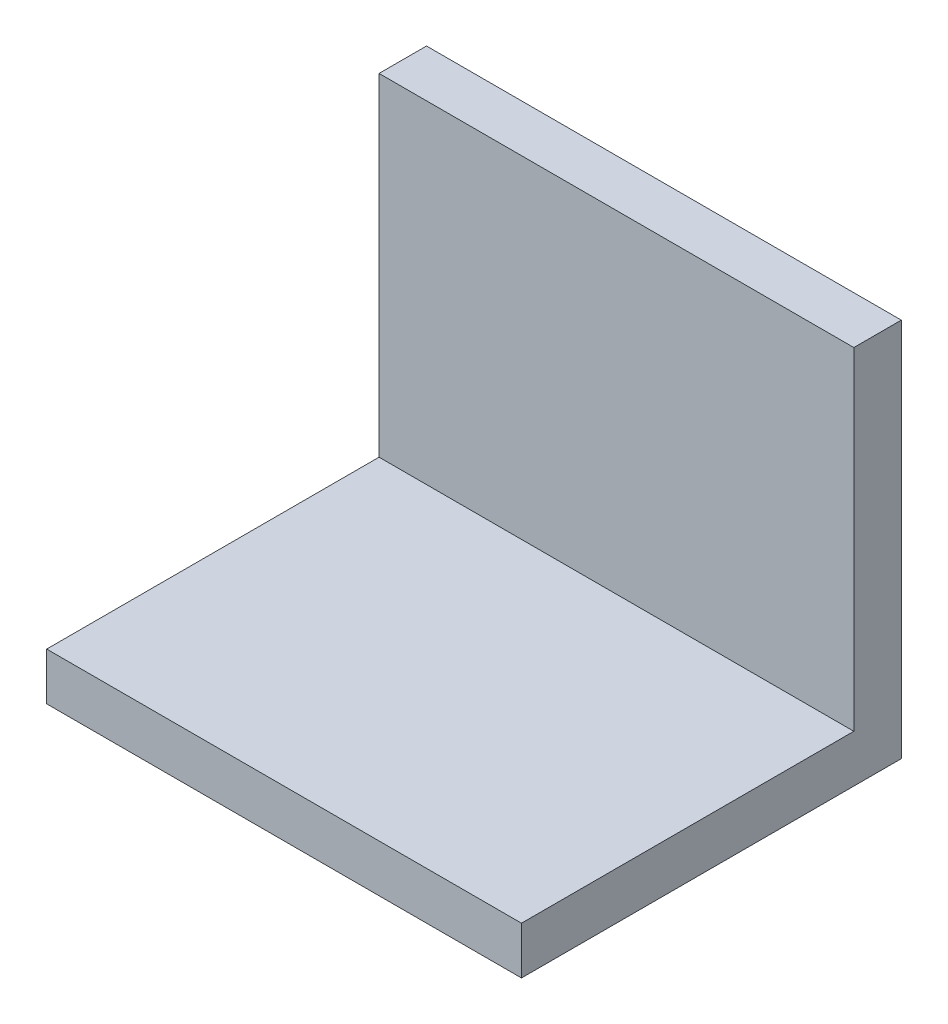
ISO-10303-21;
HEADER;
FILE_DESCRIPTION(('STEP AP214'),'2;1');
FILE_NAME('part.step','',(''),(''),'','','');
FILE_SCHEMA(('AUTOMOTIVE_DESIGN { 1 0 10303 214 1 1 1 1 }'));
ENDSEC;
DATA;
#1=APPLICATION_CONTEXT('core data for automotive mechanical design processes');
#2=APPLICATION_PROTOCOL_DEFINITION('international standard','automotive_design',2000,#1);
#3=PRODUCT_CONTEXT('',#1,'mechanical');
#4=PRODUCT('Part','Part','',(#3));
#5=PRODUCT_RELATED_PRODUCT_CATEGORY('part','',(#4));
#6=PRODUCT_DEFINITION_FORMATION('','',#4);
#7=PRODUCT_DEFINITION_CONTEXT('part definition',#1,'design');
#8=PRODUCT_DEFINITION('design','',#6,#7);
#9=PRODUCT_DEFINITION_SHAPE('','',#8);
#10=(LENGTH_UNIT() NAMED_UNIT(*) SI_UNIT(.MILLI.,.METRE.));
#11=(NAMED_UNIT(*) PLANE_ANGLE_UNIT() SI_UNIT($,.RADIAN.));
#12=(NAMED_UNIT(*) SI_UNIT($,.STERADIAN.) SOLID_ANGLE_UNIT());
#13=UNCERTAINTY_MEASURE_WITH_UNIT(LENGTH_MEASURE(1.E-05),#10,'distance_accuracy_value','');
#14=(GEOMETRIC_REPRESENTATION_CONTEXT(3) GLOBAL_UNCERTAINTY_ASSIGNED_CONTEXT((#13)) GLOBAL_UNIT_ASSIGNED_CONTEXT((#10,
#11,#12)) REPRESENTATION_CONTEXT('',''));
#15=CARTESIAN_POINT('',(0.,0.,0.));
#16=DIRECTION('',(0.,0.,1.));
#17=DIRECTION('',(1.,0.,0.));
#18=AXIS2_PLACEMENT_3D('',#15,#16,#17);
#19=CARTESIAN_POINT('',(50.,5.,0.));
#20=DIRECTION('',(0.,0.,-1.));
#21=DIRECTION('',(0.,1.,0.));
#22=AXIS2_PLACEMENT_3D('',#19,#20,#21);
#23=PLANE('',#22);
#24=DIRECTION('',(0.,-1.,0.));
#25=VECTOR('',#24,1.);
#26=CARTESIAN_POINT('',(0.,5.,0.));
#27=LINE('',#26,#25);
#28=CARTESIAN_POINT('',(0.,5.,0.));
#29=VERTEX_POINT('',#28);
#30=CARTESIAN_POINT('',(0.,0.,0.));
#31=VERTEX_POINT('',#30);
#32=EDGE_CURVE('E119',#29,#31,#27,.T.);
#33=ORIENTED_EDGE('',*,*,#32,.T.);
#34=DIRECTION('',(-1.,0.,0.));
#35=VECTOR('',#34,1.);
#36=CARTESIAN_POINT('',(50.,0.,0.));
#37=LINE('',#36,#35);
#38=CARTESIAN_POINT('',(50.,0.,0.));
#39=VERTEX_POINT('',#38);
#40=EDGE_CURVE('E11',#39,#31,#37,.T.);
#41=ORIENTED_EDGE('',*,*,#40,.F.);
#42=DIRECTION('',(0.,-1.,0.));
#43=VECTOR('',#42,1.);
#44=CARTESIAN_POINT('',(50.,5.,0.));
#45=LINE('',#44,#43);
#46=CARTESIAN_POINT('',(50.,5.,0.));
#47=VERTEX_POINT('',#46);
#48=EDGE_CURVE('E129',#47,#39,#45,.T.);
#49=ORIENTED_EDGE('',*,*,#48,.F.);
#50=DIRECTION('',(-1.,0.,0.));
#51=VECTOR('',#50,1.);
#52=CARTESIAN_POINT('',(50.,5.,0.));
#53=LINE('',#52,#51);
#54=EDGE_CURVE('E115',#47,#29,#53,.T.);
#55=ORIENTED_EDGE('',*,*,#54,.T.);
#56=EDGE_LOOP('',(#33,#41,#49,#55));
#57=FACE_BOUND('',#56,.T.);
#58=ADVANCED_FACE('F35',(#57),#23,.F.);
#59=CARTESIAN_POINT('',(50.,0.,0.));
#60=DIRECTION('',(0.,1.,0.));
#61=DIRECTION('',(0.,0.,1.));
#62=AXIS2_PLACEMENT_3D('',#59,#60,#61);
#63=PLANE('',#62);
#64=DIRECTION('',(0.,0.,-1.));
#65=VECTOR('',#64,1.);
#66=CARTESIAN_POINT('',(0.,0.,0.));
#67=LINE('',#66,#65);
#68=CARTESIAN_POINT('',(0.,0.,-40.));
#69=VERTEX_POINT('',#68);
#70=EDGE_CURVE('E122',#31,#69,#67,.T.);
#71=ORIENTED_EDGE('',*,*,#70,.T.);
#72=DIRECTION('',(-1.,0.,0.));
#73=VECTOR('',#72,1.);
#74=CARTESIAN_POINT('',(50.,0.,-40.));
#75=LINE('',#74,#73);
#76=CARTESIAN_POINT('',(50.,0.,-40.));
#77=VERTEX_POINT('',#76);
#78=EDGE_CURVE('E43',#77,#69,#75,.T.);
#79=ORIENTED_EDGE('',*,*,#78,.F.);
#80=DIRECTION('',(0.,0.,-1.));
#81=VECTOR('',#80,1.);
#82=CARTESIAN_POINT('',(50.,0.,0.));
#83=LINE('',#82,#81);
#84=EDGE_CURVE('E88',#39,#77,#83,.T.);
#85=ORIENTED_EDGE('',*,*,#84,.F.);
#86=ORIENTED_EDGE('',*,*,#40,.T.);
#87=EDGE_LOOP('',(#71,#79,#85,#86));
#88=FACE_BOUND('',#87,.T.);
#89=ADVANCED_FACE('F153',(#88),#63,.F.);
#90=CARTESIAN_POINT('',(50.,0.,-40.));
#91=DIRECTION('',(0.,0.,1.));
#92=DIRECTION('',(0.,-1.,0.));
#93=AXIS2_PLACEMENT_3D('',#90,#91,#92);
#94=PLANE('',#93);
#95=DIRECTION('',(0.,1.,0.));
#96=VECTOR('',#95,1.);
#97=CARTESIAN_POINT('',(0.,0.,-40.));
#98=LINE('',#97,#96);
#99=CARTESIAN_POINT('',(0.,40.,-40.));
#100=VERTEX_POINT('',#99);
#101=EDGE_CURVE('E124',#69,#100,#98,.T.);
#102=ORIENTED_EDGE('',*,*,#101,.T.);
#103=DIRECTION('',(-1.,0.,0.));
#104=VECTOR('',#103,1.);
#105=CARTESIAN_POINT('',(50.,40.,-40.));
#106=LINE('',#105,#104);
#107=CARTESIAN_POINT('',(50.,40.,-40.));
#108=VERTEX_POINT('',#107);
#109=EDGE_CURVE('E110',#108,#100,#106,.T.);
#110=ORIENTED_EDGE('',*,*,#109,.F.);
#111=DIRECTION('',(0.,1.,0.));
#112=VECTOR('',#111,1.);
#113=CARTESIAN_POINT('',(50.,0.,-40.));
#114=LINE('',#113,#112);
#115=EDGE_CURVE('E101',#77,#108,#114,.T.);
#116=ORIENTED_EDGE('',*,*,#115,.F.);
#117=ORIENTED_EDGE('',*,*,#78,.T.);
#118=EDGE_LOOP('',(#102,#110,#116,#117));
#119=FACE_BOUND('',#118,.T.);
#120=ADVANCED_FACE('F135',(#119),#94,.F.);
#121=CARTESIAN_POINT('',(50.,40.,-40.));
#122=DIRECTION('',(0.,-1.,0.));
#123=DIRECTION('',(0.,0.,-1.));
#124=AXIS2_PLACEMENT_3D('',#121,#122,#123);
#125=PLANE('',#124);
#126=DIRECTION('',(0.,0.,1.));
#127=VECTOR('',#126,1.);
#128=CARTESIAN_POINT('',(0.,40.,-40.));
#129=LINE('',#128,#127);
#130=CARTESIAN_POINT('',(0.,40.,-35.));
#131=VERTEX_POINT('',#130);
#132=EDGE_CURVE('E109',#100,#131,#129,.T.);
#133=ORIENTED_EDGE('',*,*,#132,.T.);
#134=DIRECTION('',(-1.,0.,0.));
#135=VECTOR('',#134,1.);
#136=CARTESIAN_POINT('',(50.,40.,-35.));
#137=LINE('',#136,#135);
#138=CARTESIAN_POINT('',(50.,40.,-35.));
#139=VERTEX_POINT('',#138);
#140=EDGE_CURVE('E106',#139,#131,#137,.T.);
#141=ORIENTED_EDGE('',*,*,#140,.F.);
#142=DIRECTION('',(0.,0.,1.));
#143=VECTOR('',#142,1.);
#144=CARTESIAN_POINT('',(50.,40.,-40.));
#145=LINE('',#144,#143);
#146=EDGE_CURVE('E95',#108,#139,#145,.T.);
#147=ORIENTED_EDGE('',*,*,#146,.F.);
#148=ORIENTED_EDGE('',*,*,#109,.T.);
#149=EDGE_LOOP('',(#133,#141,#147,#148));
#150=FACE_BOUND('',#149,.T.);
#151=ADVANCED_FACE('F107',(#150),#125,.F.);
#152=CARTESIAN_POINT('',(50.,40.,-35.));
#153=DIRECTION('',(0.,0.,-1.));
#154=DIRECTION('',(0.,1.,0.));
#155=AXIS2_PLACEMENT_3D('',#152,#153,#154);
#156=PLANE('',#155);
#157=DIRECTION('',(0.,-1.,0.));
#158=VECTOR('',#157,1.);
#159=CARTESIAN_POINT('',(0.,40.,-35.));
#160=LINE('',#159,#158);
#161=CARTESIAN_POINT('',(0.,5.,-35.));
#162=VERTEX_POINT('',#161);
#163=EDGE_CURVE('E74',#131,#162,#160,.T.);
#164=ORIENTED_EDGE('',*,*,#163,.T.);
#165=DIRECTION('',(-1.,0.,0.));
#166=VECTOR('',#165,1.);
#167=CARTESIAN_POINT('',(50.,5.,-35.));
#168=LINE('',#167,#166);
#169=CARTESIAN_POINT('',(50.,5.,-35.));
#170=VERTEX_POINT('',#169);
#171=EDGE_CURVE('E111',#170,#162,#168,.T.);
#172=ORIENTED_EDGE('',*,*,#171,.F.);
#173=DIRECTION('',(0.,-1.,0.));
#174=VECTOR('',#173,1.);
#175=CARTESIAN_POINT('',(50.,40.,-35.));
#176=LINE('',#175,#174);
#177=EDGE_CURVE('E99',#139,#170,#176,.T.);
#178=ORIENTED_EDGE('',*,*,#177,.F.);
#179=ORIENTED_EDGE('',*,*,#140,.T.);
#180=EDGE_LOOP('',(#164,#172,#178,#179));
#181=FACE_BOUND('',#180,.T.);
#182=ADVANCED_FACE('F113',(#181),#156,.F.);
#183=CARTESIAN_POINT('',(50.,5.,-35.));
#184=DIRECTION('',(0.,-1.,0.));
#185=DIRECTION('',(0.,0.,-1.));
#186=AXIS2_PLACEMENT_3D('',#183,#184,#185);
#187=PLANE('',#186);
#188=DIRECTION('',(0.,0.,1.));
#189=VECTOR('',#188,1.);
#190=CARTESIAN_POINT('',(0.,5.,-35.));
#191=LINE('',#190,#189);
#192=EDGE_CURVE('E80',#162,#29,#191,.T.);
#193=ORIENTED_EDGE('',*,*,#192,.T.);
#194=ORIENTED_EDGE('',*,*,#54,.F.);
#195=DIRECTION('',(0.,0.,1.));
#196=VECTOR('',#195,1.);
#197=CARTESIAN_POINT('',(50.,5.,-35.));
#198=LINE('',#197,#196);
#199=EDGE_CURVE('E51',#170,#47,#198,.T.);
#200=ORIENTED_EDGE('',*,*,#199,.F.);
#201=ORIENTED_EDGE('',*,*,#171,.T.);
#202=EDGE_LOOP('',(#193,#194,#200,#201));
#203=FACE_BOUND('',#202,.T.);
#204=ADVANCED_FACE('F142',(#203),#187,.F.);
#205=CARTESIAN_POINT('',(50.,0.,0.));
#206=DIRECTION('',(1.,0.,0.));
#207=DIRECTION('',(0.,0.,-1.));
#208=AXIS2_PLACEMENT_3D('',#205,#206,#207);
#209=PLANE('',#208);
#210=ORIENTED_EDGE('',*,*,#48,.T.);
#211=ORIENTED_EDGE('',*,*,#84,.T.);
#212=ORIENTED_EDGE('',*,*,#115,.T.);
#213=ORIENTED_EDGE('',*,*,#146,.T.);
#214=ORIENTED_EDGE('',*,*,#177,.T.);
#215=ORIENTED_EDGE('',*,*,#199,.T.);
#216=EDGE_LOOP('',(#210,#211,#212,#213,#214,#215));
#217=FACE_BOUND('',#216,.T.);
#218=ADVANCED_FACE('F97',(#217),#209,.T.);
#219=CARTESIAN_POINT('',(0.,0.,0.));
#220=DIRECTION('',(1.,0.,0.));
#221=DIRECTION('',(0.,0.,-1.));
#222=AXIS2_PLACEMENT_3D('',#219,#220,#221);
#223=PLANE('',#222);
#224=ORIENTED_EDGE('',*,*,#32,.F.);
#225=ORIENTED_EDGE('',*,*,#192,.F.);
#226=ORIENTED_EDGE('',*,*,#163,.F.);
#227=ORIENTED_EDGE('',*,*,#132,.F.);
#228=ORIENTED_EDGE('',*,*,#101,.F.);
#229=ORIENTED_EDGE('',*,*,#70,.F.);
#230=EDGE_LOOP('',(#224,#225,#226,#227,#228,#229));
#231=FACE_BOUND('',#230,.T.);
#232=ADVANCED_FACE('F138',(#231),#223,.F.);
#233=CLOSED_SHELL('',(#58,#89,#120,#151,#182,#204,#218,#232));
#234=MANIFOLD_SOLID_BREP('B2',#233);
#235=ADVANCED_BREP_SHAPE_REPRESENTATION('',(#18,#234),#14);
#236=SHAPE_DEFINITION_REPRESENTATION(#9,#235);
ENDSEC;
END-ISO-10303-21;
